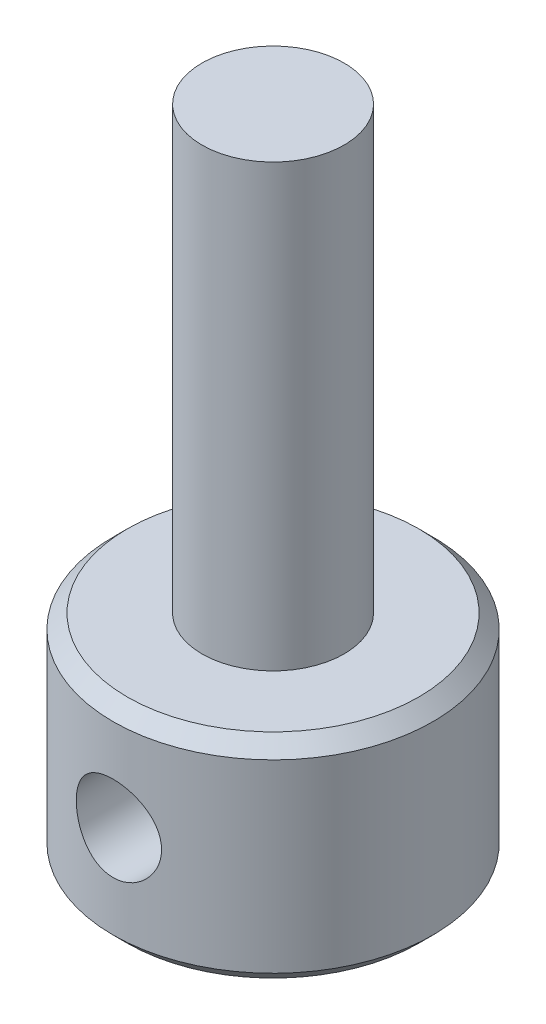
ISO-10303-21;
HEADER;
FILE_DESCRIPTION(('STEP AP214'),'2;1');
FILE_NAME('part.step','',(''),(''),'','','');
FILE_SCHEMA(('AUTOMOTIVE_DESIGN { 1 0 10303 214 1 1 1 1 }'));
ENDSEC;
DATA;
#1=APPLICATION_CONTEXT('core data for automotive mechanical design processes');
#2=APPLICATION_PROTOCOL_DEFINITION('international standard','automotive_design',2000,#1);
#3=PRODUCT_CONTEXT('',#1,'mechanical');
#4=PRODUCT('Part','Part','',(#3));
#5=PRODUCT_RELATED_PRODUCT_CATEGORY('part','',(#4));
#6=PRODUCT_DEFINITION_FORMATION('','',#4);
#7=PRODUCT_DEFINITION_CONTEXT('part definition',#1,'design');
#8=PRODUCT_DEFINITION('design','',#6,#7);
#9=PRODUCT_DEFINITION_SHAPE('','',#8);
#10=(LENGTH_UNIT() NAMED_UNIT(*) SI_UNIT(.MILLI.,.METRE.));
#11=(NAMED_UNIT(*) PLANE_ANGLE_UNIT() SI_UNIT($,.RADIAN.));
#12=(NAMED_UNIT(*) SI_UNIT($,.STERADIAN.) SOLID_ANGLE_UNIT());
#13=UNCERTAINTY_MEASURE_WITH_UNIT(LENGTH_MEASURE(1.E-05),#10,'distance_accuracy_value','');
#14=(GEOMETRIC_REPRESENTATION_CONTEXT(3) GLOBAL_UNCERTAINTY_ASSIGNED_CONTEXT((#13)) GLOBAL_UNIT_ASSIGNED_CONTEXT((#10,
#11,#12)) REPRESENTATION_CONTEXT('',''));
#15=CARTESIAN_POINT('',(0.,0.,0.));
#16=DIRECTION('',(0.,0.,1.));
#17=DIRECTION('',(1.,0.,0.));
#18=AXIS2_PLACEMENT_3D('',#15,#16,#17);
#19=CARTESIAN_POINT('',(0.,15.,0.));
#20=DIRECTION('',(0.,-1.,0.));
#21=DIRECTION('',(0.,0.,-1.));
#22=AXIS2_PLACEMENT_3D('',#19,#20,#21);
#23=CYLINDRICAL_SURFACE('',#22,11.25);
#24=CARTESIAN_POINT('',(0.,10.5,-11.25));
#25=CARTESIAN_POINT('',(-0.165381833749281,10.4999960745977,-11.2499975071524));
#26=CARTESIAN_POINT('',(-0.33080574033276,10.4862785787155,-11.2463172924323));
#27=CARTESIAN_POINT('',(-0.656888177031693,10.4318681538919,-11.2319936043249));
#28=CARTESIAN_POINT('',(-0.817544374978628,10.3911622433608,-11.2213467799888));
#29=CARTESIAN_POINT('',(-1.12933738356797,10.2841924997039,-11.1942649987919));
#30=CARTESIAN_POINT('',(-1.28048617652292,10.217961618501,-11.1778375069556));
#31=CARTESIAN_POINT('',(-1.56953052958898,10.0619441360001,-11.1409304872752));
#32=CARTESIAN_POINT('',(-1.70742520567443,9.97215596496106,-11.1204506894277));
#33=CARTESIAN_POINT('',(-1.96924425561002,9.76937472537994,-11.0771192235299));
#34=CARTESIAN_POINT('',(-2.09281753479417,9.6559369979876,-11.0542270151802));
#35=CARTESIAN_POINT('',(-2.31943070490956,9.41002727540496,-11.0089111451939));
#36=CARTESIAN_POINT('',(-2.42246795243496,9.2775528335737,-10.9864875442086));
#37=CARTESIAN_POINT('',(-2.60679613865122,8.99452764776182,-10.9442330619656));
#38=CARTESIAN_POINT('',(-2.6876831660473,8.8437055076074,-10.9244533284486));
#39=CARTESIAN_POINT('',(-2.8228132211549,8.52998983336136,-10.8903221597728));
#40=CARTESIAN_POINT('',(-2.87706116177052,8.36709853150284,-10.875969723799));
#41=CARTESIAN_POINT('',(-2.95615380339755,8.03775669326247,-10.854736737036));
#42=CARTESIAN_POINT('',(-2.98163505367037,7.87146969010389,-10.8476947171724));
#43=CARTESIAN_POINT('',(-3.00445552058729,7.53684347504019,-10.8413974637456));
#44=CARTESIAN_POINT('',(-3.00179999558629,7.3685046524639,-10.8421407752167));
#45=CARTESIAN_POINT('',(-2.96892765004048,7.03952187693891,-10.8511856820305));
#46=CARTESIAN_POINT('',(-2.93948109097146,6.87879422694227,-10.859276032673));
#47=CARTESIAN_POINT('',(-2.85509623083273,6.56464749831564,-10.8817651962103));
#48=CARTESIAN_POINT('',(-2.80015589239491,6.41122900488698,-10.8961645132892));
#49=CARTESIAN_POINT('',(-2.66571535447883,6.11404778428714,-10.9298349262258));
#50=CARTESIAN_POINT('',(-2.58594511706676,5.97041349107062,-10.9491591422805));
#51=CARTESIAN_POINT('',(-2.40429755735666,5.69829876172272,-10.9904734446367));
#52=CARTESIAN_POINT('',(-2.30241588336377,5.5698213162653,-11.0124640553278));
#53=CARTESIAN_POINT('',(-2.07549910895128,5.32726650381781,-11.057512659448));
#54=CARTESIAN_POINT('',(-1.94981719092448,5.21379552252758,-11.0805820723325));
#55=CARTESIAN_POINT('',(-1.68092650230955,5.00941682947458,-11.1245457191447));
#56=CARTESIAN_POINT('',(-1.53771704130763,4.91851000694637,-11.1454398673283));
#57=CARTESIAN_POINT('',(-1.23689738324617,4.76157314576303,-11.1828273059744));
#58=CARTESIAN_POINT('',(-1.07922735382768,4.69565284432712,-11.1993010925034));
#59=CARTESIAN_POINT('',(-0.754503441585591,4.59142921677995,-11.225850666015));
#60=CARTESIAN_POINT('',(-0.587451617892484,4.55311985591407,-11.2359278510062));
#61=CARTESIAN_POINT('',(-0.253881124718273,4.50615768462327,-11.2483373783758));
#62=CARTESIAN_POINT('',(-0.0874863564620711,4.49668044022371,-11.2508849620644));
#63=CARTESIAN_POINT('',(0.244515068851796,4.50537474637042,-11.2485670753754));
#64=CARTESIAN_POINT('',(0.410121805593168,4.52354343915866,-11.2437023712053));
#65=CARTESIAN_POINT('',(0.732903674852666,4.58633767118997,-11.2272455324403));
#66=CARTESIAN_POINT('',(0.890174778041669,4.63050336929666,-11.2157703981949));
#67=CARTESIAN_POINT('',(1.19506045676409,4.74350391676193,-11.1873944234121));
#68=CARTESIAN_POINT('',(1.34267398382404,4.81234143937582,-11.1704929949425));
#69=CARTESIAN_POINT('',(1.62725771200192,4.97426083077081,-11.1326349083928));
#70=CARTESIAN_POINT('',(1.76396278269177,5.06779120019663,-11.1116052990739));
#71=CARTESIAN_POINT('',(2.02002695309571,5.27587744523699,-11.0679217854839));
#72=CARTESIAN_POINT('',(2.13938261819877,5.39043747390155,-11.0452675609146));
#73=CARTESIAN_POINT('',(2.36083386718159,5.64117836624188,-11.0000961879988));
#74=CARTESIAN_POINT('',(2.46234778874719,5.77787784209289,-10.9776009214329));
#75=CARTESIAN_POINT('',(2.64100786777681,6.06684704414931,-10.9359967077477));
#76=CARTESIAN_POINT('',(2.71815504183256,6.21911612043297,-10.9168876193702));
#77=CARTESIAN_POINT('',(2.84531117379153,6.53414296061465,-10.8844390255729));
#78=CARTESIAN_POINT('',(2.89547718380879,6.69683371772819,-10.8710662246761));
#79=CARTESIAN_POINT('',(2.96761807678242,7.02875897951031,-10.8515973769961));
#80=CARTESIAN_POINT('',(2.98960016403926,7.19799180051509,-10.8454994706511));
#81=CARTESIAN_POINT('',(3.00433484480408,7.53224218184145,-10.8414261682644));
#82=CARTESIAN_POINT('',(2.99802233426346,7.69721598042999,-10.8431909649016));
#83=CARTESIAN_POINT('',(2.95851563999893,8.02365527105287,-10.8540359399729));
#84=CARTESIAN_POINT('',(2.92532214802484,8.18512085325716,-10.8631159301592));
#85=CARTESIAN_POINT('',(2.83353773549845,8.49878362818017,-10.8874135664265));
#86=CARTESIAN_POINT('',(2.77514491613449,8.65104276409436,-10.902583275383));
#87=CARTESIAN_POINT('',(2.63477331843499,8.94371824580512,-10.9373522719544));
#88=CARTESIAN_POINT('',(2.55279084036903,9.0841327294518,-10.9569522542965));
#89=CARTESIAN_POINT('',(2.36473363903247,9.35359553924382,-10.9990938216316));
#90=CARTESIAN_POINT('',(2.25802094651869,9.48218780246402,-11.021704996532));
#91=CARTESIAN_POINT('',(2.02474580266644,9.71994367750127,-11.0669325567385));
#92=CARTESIAN_POINT('',(1.8981785315381,9.82910255800333,-11.0895489419748));
#93=CARTESIAN_POINT('',(1.62551997163304,10.0271883564702,-11.1328171860614));
#94=CARTESIAN_POINT('',(1.47906894262767,10.115632515974,-11.1534166697187));
#95=CARTESIAN_POINT('',(1.17283296062533,10.2665061238941,-11.189757151543));
#96=CARTESIAN_POINT('',(1.01305664204444,10.3289522634954,-11.2055012652538));
#97=CARTESIAN_POINT('',(0.711562057321484,10.4179129281233,-11.2283212877021));
#98=CARTESIAN_POINT('',(0.571143024847551,10.4486240753887,-11.2363915588891));
#99=CARTESIAN_POINT('',(0.287159692975612,10.4896683092506,-11.2472317355468));
#100=CARTESIAN_POINT('',(0.143595705607289,10.5000034083,-11.250002164459));
#101=CARTESIAN_POINT('',(0.,10.5,-11.25));
#102=B_SPLINE_CURVE_WITH_KNOTS('',3,(#24,#25,#26,#27,#28,#29,#30,#31,#32,#33,#34,#35,#36,#37,
#38,#39,#40,#41,#42,#43,#44,#45,#46,#47,#48,#49,#50,#51,#52,#53,#54,#55,#56,#57,#58,#59,#60,#61,
#62,#63,#64,#65,#66,#67,#68,#69,#70,#71,#72,#73,#74,#75,#76,#77,#78,#79,#80,#81,#82,#83,#84,#85,
#86,#87,#88,#89,#90,#91,#92,#93,#94,#95,#96,#97,#98,#99,#100,#101),.UNSPECIFIED.,.T.,.F.,(4,2,2,
2,2,2,2,2,2,2,2,2,2,2,2,2,2,2,2,2,2,2,2,2,2,2,2,2,2,2,2,2,2,2,2,2,2,2,4),(0.,0.495618898424352,
0.991476365642173,1.48669582945789,1.98194830063012,2.4875234693245,2.99316367387723,
3.50748873784843,4.02171891194548,4.52433237375701,5.02685190606478,5.51536503068993,
6.00391720219408,6.49798010019745,6.99214032176442,7.50241889718481,8.01271757906394,
8.5252321440456,9.03763465785205,9.53524076286818,10.0327954338802,10.5218030346317,
11.0108636366342,11.5095042900682,12.0082435238833,12.5210474457418,13.0338299703616,
13.5435944654908,14.0532286299597,14.5461501360817,15.0390589578628,15.5281614817784,
16.0173407568989,16.5209150936247,17.0246118650406,17.5390837842673,18.0532248922316,
18.4835972849539,18.9139271695496),.UNSPECIFIED.);
#103=CARTESIAN_POINT('',(0.,10.5,-11.25));
#104=VERTEX_POINT('',#103);
#105=EDGE_CURVE('E11',#104,#104,#102,.T.);
#106=ORIENTED_EDGE('',*,*,#105,.T.);
#107=EDGE_LOOP('',(#106));
#108=FACE_BOUND('',#107,.T.);
#109=CARTESIAN_POINT('',(2.99999999999999,7.5,10.8426242211007));
#110=CARTESIAN_POINT('',(2.99999601473806,7.33473609338958,10.8426270854588));
#111=CARTESIAN_POINT('',(2.98629739837113,7.16942999928598,10.8464439682451));
#112=CARTESIAN_POINT('',(2.93196874890355,6.84359186766544,10.8612534173265));
#113=CARTESIAN_POINT('',(2.89132520431428,6.68306226753291,10.872249583619));
#114=CARTESIAN_POINT('',(2.78453768340109,6.37153789507984,10.9000856276526));
#115=CARTESIAN_POINT('',(2.71842956313266,6.22053006175736,10.9169172852631));
#116=CARTESIAN_POINT('',(2.56270176845555,5.93172488991027,10.954517323806));
#117=CARTESIAN_POINT('',(2.47308026762174,5.79392857873953,10.9752860105164));
#118=CARTESIAN_POINT('',(2.27047271811839,5.53201117951843,11.019002093302));
#119=CARTESIAN_POINT('',(2.15700446256312,5.40826947380331,11.0419881167466));
#120=CARTESIAN_POINT('',(1.91096140926031,5.18132763457321,11.0872155215476));
#121=CARTESIAN_POINT('',(1.77838463301996,5.07812963078732,11.1094568255016));
#122=CARTESIAN_POINT('',(1.4952572563099,4.89362259239562,11.1511198270263));
#123=CARTESIAN_POINT('',(1.34445272981922,4.81269072205072,11.1704906439344));
#124=CARTESIAN_POINT('',(1.03077456709363,4.67747304694912,11.2037868931775));
#125=CARTESIAN_POINT('',(0.867902971312652,4.62318274907767,11.2177132436439));
#126=CARTESIAN_POINT('',(0.538673942715133,4.54401716964635,11.2382783036469));
#127=CARTESIAN_POINT('',(0.372481836301373,4.51849653506113,11.2450766512539));
#128=CARTESIAN_POINT('',(0.0380453302628614,4.49556431983925,11.2511778692663));
#129=CARTESIAN_POINT('',(-0.130198721157799,4.49814803455481,11.2504819941992));
#130=CARTESIAN_POINT('',(-0.459471355667015,4.53089671880921,11.2417901378964));
#131=CARTESIAN_POINT('',(-0.62057490108165,4.56036443645441,11.2339787104046));
#132=CARTESIAN_POINT('',(-0.935461973356595,4.64491820667296,11.2121512288574));
#133=CARTESIAN_POINT('',(-1.08924508227092,4.70000572002918,11.1981348210102));
#134=CARTESIAN_POINT('',(-1.38690591772127,4.83476977138847,11.165198536497));
#135=CARTESIAN_POINT('',(-1.5306700294941,4.91468521065065,11.14623131816));
#136=CARTESIAN_POINT('',(-1.80298499814697,5.09665322926406,11.1054370276476));
#137=CARTESIAN_POINT('',(-1.93153288212955,5.19871012354381,11.083609398364));
#138=CARTESIAN_POINT('',(-2.17392805419762,5.42576528689929,11.0386690940612));
#139=CARTESIAN_POINT('',(-2.28720288026361,5.55137166756806,11.0155375404569));
#140=CARTESIAN_POINT('',(-2.49121998157453,5.82003701436421,10.971201075427));
#141=CARTESIAN_POINT('',(-2.58196088295827,5.96309704382304,10.9499962815231));
#142=CARTESIAN_POINT('',(-2.73877018778549,6.2638501527145,10.9118385339322));
#143=CARTESIAN_POINT('',(-2.80468299897022,6.42162802629605,10.8949126053377));
#144=CARTESIAN_POINT('',(-2.90886002524668,6.7465897491058,10.8675648752703));
#145=CARTESIAN_POINT('',(-2.94713109690983,6.91377125465212,10.8571414609274));
#146=CARTESIAN_POINT('',(-2.99395135640191,7.24744081655888,10.844322534462));
#147=CARTESIAN_POINT('',(-3.00335448932008,7.41380032293635,10.8416964482734));
#148=CARTESIAN_POINT('',(-2.99452471684211,7.74571465920845,10.8441386757907));
#149=CARTESIAN_POINT('',(-2.97629475258418,7.91126957285876,10.8492061706276));
#150=CARTESIAN_POINT('',(-2.91346907805019,8.23358489113846,10.8662418648016));
#151=CARTESIAN_POINT('',(-2.86938671869399,8.39045315690615,10.8780755954945));
#152=CARTESIAN_POINT('',(-2.75668480088194,8.69456944703959,10.9071790342868));
#153=CARTESIAN_POINT('',(-2.68806203814971,8.84181621214105,10.9244494522271));
#154=CARTESIAN_POINT('',(-2.52649358263064,9.1260824361529,10.9629535870961));
#155=CARTESIAN_POINT('',(-2.43304642856887,9.26280596383462,10.9842660730933));
#156=CARTESIAN_POINT('',(-2.2251034198127,9.51894495255471,11.0282676290046));
#157=CARTESIAN_POINT('',(-2.11060360834449,9.63835715243121,11.0509569571535));
#158=CARTESIAN_POINT('',(-1.85985567375726,9.86002870987488,11.0959494732669));
#159=CARTESIAN_POINT('',(-1.72307462401327,9.96169256546787,11.1182225478578));
#160=CARTESIAN_POINT('',(-1.43389265391111,10.1406164811158,11.1592000502569));
#161=CARTESIAN_POINT('',(-1.28149256552832,10.2178778401184,11.1779046679936));
#162=CARTESIAN_POINT('',(-0.966471202238804,10.3450944485423,11.2095172634889));
#163=CARTESIAN_POINT('',(-0.803936779323502,10.3952535291652,11.2224683772058));
#164=CARTESIAN_POINT('',(-0.472349077096978,10.4674330920965,11.2413045568087));
#165=CARTESIAN_POINT('',(-0.303297250980363,10.489459810162,11.2471911885747));
#166=CARTESIAN_POINT('',(0.0309630020192249,10.5043587356121,11.2511612015654));
#167=CARTESIAN_POINT('',(0.196130267291797,10.4981044786967,11.2494783943212));
#168=CARTESIAN_POINT('',(0.522972456946076,10.4586472596372,11.2390273646829));
#169=CARTESIAN_POINT('',(0.684647512219221,10.4254453093244,11.2302594083218));
#170=CARTESIAN_POINT('',(0.998865185196313,10.3335290926221,11.2066696558638));
#171=CARTESIAN_POINT('',(1.15146301777731,10.2749920597913,11.1918899578384));
#172=CARTESIAN_POINT('',(1.44475814770703,10.1342255973806,11.1578222477474));
#173=CARTESIAN_POINT('',(1.58545377249322,10.0519928450808,11.1385336034888));
#174=CARTESIAN_POINT('',(1.8550174030105,9.86361259179446,11.0968699683618));
#175=CARTESIAN_POINT('',(1.98347004259996,9.756885928952,11.0744264005745));
#176=CARTESIAN_POINT('',(2.22093805734199,9.52364587595263,11.0292600011588));
#177=CARTESIAN_POINT('',(2.32994830864572,9.39712728627097,11.0065370975958));
#178=CARTESIAN_POINT('',(2.52781050348842,9.12454740627359,10.9628093945828));
#179=CARTESIAN_POINT('',(2.61616641391849,8.97811752951418,10.9418533683697));
#180=CARTESIAN_POINT('',(2.76688033545081,8.67194053370964,10.9047209085521));
#181=CARTESIAN_POINT('',(2.82925535050997,8.51220220719077,10.8885413508742));
#182=CARTESIAN_POINT('',(2.91807186378721,8.21087799592311,10.8650400098081));
#183=CARTESIAN_POINT('',(2.94872277599233,8.07059810316492,10.8567021040829));
#184=CARTESIAN_POINT('',(2.98968741440819,7.78688916300904,10.8454932781736));
#185=CARTESIAN_POINT('',(3.00000345948239,7.64346047656678,10.8426217346403));
#186=CARTESIAN_POINT('',(2.99999999999999,7.5,10.8426242211007));
#187=B_SPLINE_CURVE_WITH_KNOTS('',3,(#109,#110,#111,#112,#113,#114,#115,#116,#117,#118,#119,
#120,#121,#122,#123,#124,#125,#126,#127,#128,#129,#130,#131,#132,#133,#134,#135,#136,#137,#138,
#139,#140,#141,#142,#143,#144,#145,#146,#147,#148,#149,#150,#151,#152,#153,#154,#155,#156,#157,
#158,#159,#160,#161,#162,#163,#164,#165,#166,#167,#168,#169,#170,#171,#172,#173,#174,#175,#176,
#177,#178,#179,#180,#181,#182,#183,#184,#185,#186),.UNSPECIFIED.,.T.,.F.,(4,2,2,2,2,2,2,2,2,2,2,
2,2,2,2,2,2,2,2,2,2,2,2,2,2,2,2,2,2,2,2,2,2,2,2,2,2,2,4),(0.,0.495264192174037,
0.990776921775299,1.48559446739425,1.98045045984156,2.48648874195316,2.99257945686691,
3.50677811056204,4.02089001456368,4.52322456474719,5.02547502578403,5.51505856201204,
6.00467001661041,6.49914673358353,6.99371990091735,7.50347643450492,8.01326403959366,
8.52619522646514,9.03899913631449,9.53648001366723,10.0339079451894,10.5217777565255,
11.0097112930092,11.5083695245535,12.007121573159,12.5202886044314,13.0334283151584,
13.5426530939079,14.0517649794219,14.5452608237838,15.0387381392313,15.5288177230668,
16.0189660615263,16.5221828099105,17.0255319807526,17.5399505848205,18.0540319815565,
18.4840045151098,18.9139280143966),.UNSPECIFIED.);
#188=CARTESIAN_POINT('',(2.99999999999999,7.5,10.8426242211007));
#189=VERTEX_POINT('',#188);
#190=EDGE_CURVE('E56',#189,#189,#187,.T.);
#191=ORIENTED_EDGE('',*,*,#190,.T.);
#192=EDGE_LOOP('',(#191));
#193=FACE_BOUND('',#192,.T.);
#194=CARTESIAN_POINT('',(0.,1.,0.));
#195=DIRECTION('',(0.,1.,0.));
#196=DIRECTION('',(0.,0.,1.));
#197=AXIS2_PLACEMENT_3D('',#194,#195,#196);
#198=CIRCLE('',#197,11.25);
#199=CARTESIAN_POINT('',(0.,1.,11.25));
#200=VERTEX_POINT('',#199);
#201=EDGE_CURVE('E105',#200,#200,#198,.T.);
#202=ORIENTED_EDGE('',*,*,#201,.T.);
#203=EDGE_LOOP('',(#202));
#204=FACE_BOUND('',#203,.T.);
#205=CARTESIAN_POINT('',(0.,14.,0.));
#206=DIRECTION('',(0.,1.,0.));
#207=DIRECTION('',(0.,0.,1.));
#208=AXIS2_PLACEMENT_3D('',#205,#206,#207);
#209=CIRCLE('',#208,11.25);
#210=CARTESIAN_POINT('',(0.,14.,11.25));
#211=VERTEX_POINT('',#210);
#212=EDGE_CURVE('E108',#211,#211,#209,.F.);
#213=ORIENTED_EDGE('',*,*,#212,.T.);
#214=EDGE_LOOP('',(#213));
#215=FACE_BOUND('',#214,.T.);
#216=ADVANCED_FACE('F43',(#108,#193,#204,#215),#23,.T.);
#217=CARTESIAN_POINT('',(0.,15.,0.));
#218=DIRECTION('',(0.,1.,0.));
#219=DIRECTION('',(0.,0.,1.));
#220=AXIS2_PLACEMENT_3D('',#217,#218,#219);
#221=PLANE('',#220);
#222=CARTESIAN_POINT('',(0.,15.,0.));
#223=DIRECTION('',(0.,1.,0.));
#224=DIRECTION('',(0.,0.,1.));
#225=AXIS2_PLACEMENT_3D('',#222,#223,#224);
#226=CIRCLE('',#225,10.25);
#227=CARTESIAN_POINT('',(0.,15.,10.25));
#228=VERTEX_POINT('',#227);
#229=EDGE_CURVE('E60',#228,#228,#226,.T.);
#230=ORIENTED_EDGE('',*,*,#229,.T.);
#231=EDGE_LOOP('',(#230));
#232=FACE_BOUND('',#231,.T.);
#233=CARTESIAN_POINT('',(0.,15.,0.));
#234=DIRECTION('',(0.,1.,0.));
#235=DIRECTION('',(0.,0.,1.));
#236=AXIS2_PLACEMENT_3D('',#233,#234,#235);
#237=CIRCLE('',#236,5.);
#238=CARTESIAN_POINT('',(0.,15.,5.));
#239=VERTEX_POINT('',#238);
#240=EDGE_CURVE('E110',#239,#239,#237,.T.);
#241=ORIENTED_EDGE('',*,*,#240,.F.);
#242=EDGE_LOOP('',(#241));
#243=FACE_BOUND('',#242,.T.);
#244=ADVANCED_FACE('F88',(#232,#243),#221,.T.);
#245=CARTESIAN_POINT('',(0.,0.,0.));
#246=DIRECTION('',(0.,1.,0.));
#247=DIRECTION('',(0.,0.,1.));
#248=AXIS2_PLACEMENT_3D('',#245,#246,#247);
#249=PLANE('',#248);
#250=CARTESIAN_POINT('',(0.,0.,0.));
#251=DIRECTION('',(0.,1.,0.));
#252=DIRECTION('',(0.,0.,1.));
#253=AXIS2_PLACEMENT_3D('',#250,#251,#252);
#254=CIRCLE('',#253,10.25);
#255=CARTESIAN_POINT('',(0.,0.,10.25));
#256=VERTEX_POINT('',#255);
#257=EDGE_CURVE('E64',#256,#256,#254,.F.);
#258=ORIENTED_EDGE('',*,*,#257,.T.);
#259=EDGE_LOOP('',(#258));
#260=FACE_BOUND('',#259,.T.);
#261=ADVANCED_FACE('F86',(#260),#249,.F.);
#262=CARTESIAN_POINT('',(0.,46.,0.));
#263=DIRECTION('',(0.,-1.,0.));
#264=DIRECTION('',(0.,0.,-1.));
#265=AXIS2_PLACEMENT_3D('',#262,#263,#264);
#266=CYLINDRICAL_SURFACE('',#265,5.);
#267=CARTESIAN_POINT('',(0.,46.,0.));
#268=DIRECTION('',(0.,1.,0.));
#269=DIRECTION('',(0.,0.,1.));
#270=AXIS2_PLACEMENT_3D('',#267,#268,#269);
#271=CIRCLE('',#270,5.);
#272=CARTESIAN_POINT('',(0.,46.,5.));
#273=VERTEX_POINT('',#272);
#274=EDGE_CURVE('E114',#273,#273,#271,.T.);
#275=ORIENTED_EDGE('',*,*,#274,.F.);
#276=EDGE_LOOP('',(#275));
#277=FACE_BOUND('',#276,.T.);
#278=ORIENTED_EDGE('',*,*,#240,.T.);
#279=EDGE_LOOP('',(#278));
#280=FACE_BOUND('',#279,.T.);
#281=ADVANCED_FACE('F82',(#277,#280),#266,.T.);
#282=CARTESIAN_POINT('',(0.,46.,0.));
#283=DIRECTION('',(0.,1.,0.));
#284=DIRECTION('',(0.,0.,1.));
#285=AXIS2_PLACEMENT_3D('',#282,#283,#284);
#286=PLANE('',#285);
#287=ORIENTED_EDGE('',*,*,#274,.T.);
#288=EDGE_LOOP('',(#287));
#289=FACE_BOUND('',#288,.T.);
#290=ADVANCED_FACE('F77',(#289),#286,.T.);
#291=CARTESIAN_POINT('',(0.,1.,0.));
#292=DIRECTION('',(0.,1.,0.));
#293=DIRECTION('',(0.,0.,1.));
#294=AXIS2_PLACEMENT_3D('',#291,#292,#293);
#295=CONICAL_SURFACE('',#294,11.25,0.78539816339745);
#296=ORIENTED_EDGE('',*,*,#257,.F.);
#297=EDGE_LOOP('',(#296));
#298=FACE_BOUND('',#297,.T.);
#299=ORIENTED_EDGE('',*,*,#201,.F.);
#300=EDGE_LOOP('',(#299));
#301=FACE_BOUND('',#300,.T.);
#302=ADVANCED_FACE('F81',(#298,#301),#295,.T.);
#303=CARTESIAN_POINT('',(0.,15.,0.));
#304=DIRECTION('',(0.,-1.,0.));
#305=DIRECTION('',(0.,0.,-1.));
#306=AXIS2_PLACEMENT_3D('',#303,#304,#305);
#307=CONICAL_SURFACE('',#306,10.25,0.785398163397449);
#308=ORIENTED_EDGE('',*,*,#212,.F.);
#309=EDGE_LOOP('',(#308));
#310=FACE_BOUND('',#309,.T.);
#311=ORIENTED_EDGE('',*,*,#229,.F.);
#312=EDGE_LOOP('',(#311));
#313=FACE_BOUND('',#312,.T.);
#314=ADVANCED_FACE('F46',(#310,#313),#307,.T.);
#315=CARTESIAN_POINT('',(0.,7.5,11.25));
#316=DIRECTION('',(0.,0.,1.));
#317=DIRECTION('',(1.,0.,0.));
#318=AXIS2_PLACEMENT_3D('',#315,#316,#317);
#319=CYLINDRICAL_SURFACE('',#318,2.99999999999999);
#320=ORIENTED_EDGE('',*,*,#190,.F.);
#321=EDGE_LOOP('',(#320));
#322=FACE_BOUND('',#321,.T.);
#323=ORIENTED_EDGE('',*,*,#105,.F.);
#324=EDGE_LOOP('',(#323));
#325=FACE_BOUND('',#324,.T.);
#326=ADVANCED_FACE('F72',(#322,#325),#319,.F.);
#327=CLOSED_SHELL('',(#216,#244,#261,#281,#290,#302,#314,#326));
#328=MANIFOLD_SOLID_BREP('B2',#327);
#329=ADVANCED_BREP_SHAPE_REPRESENTATION('',(#18,#328),#14);
#330=SHAPE_DEFINITION_REPRESENTATION(#9,#329);
ENDSEC;
END-ISO-10303-21;
